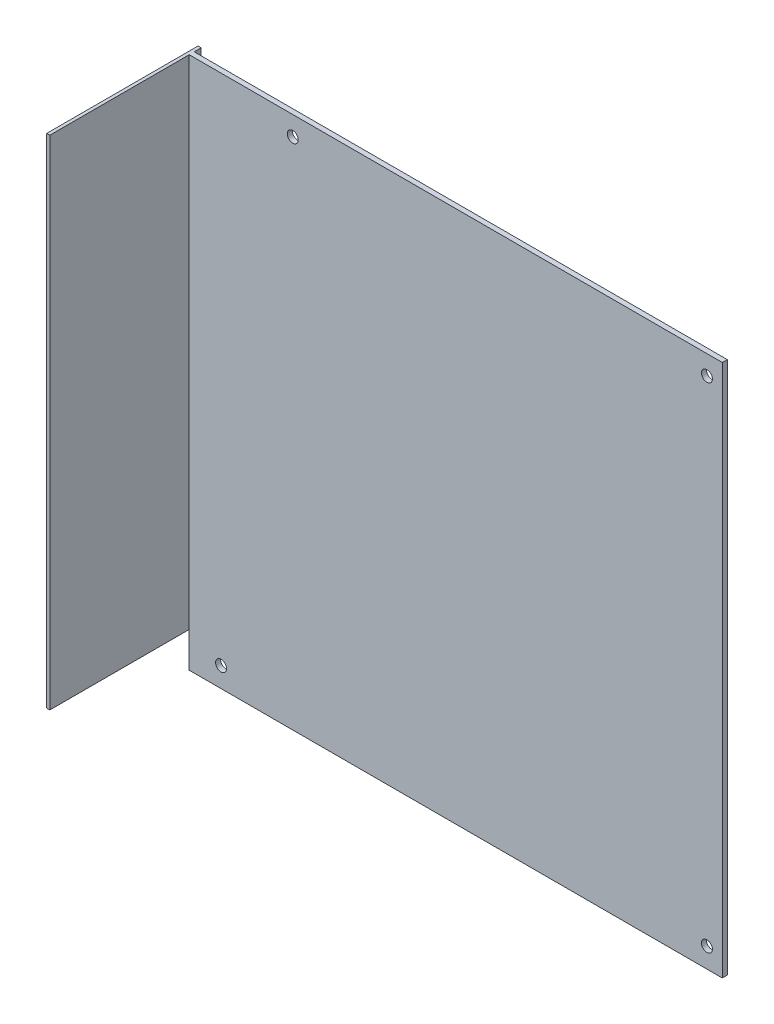
ISO-10303-21;
HEADER;
FILE_DESCRIPTION(('STEP AP214'),'2;1');
FILE_NAME('part.step','',(''),(''),'','','');
FILE_SCHEMA(('AUTOMOTIVE_DESIGN { 1 0 10303 214 1 1 1 1 }'));
ENDSEC;
DATA;
#1=APPLICATION_CONTEXT('core data for automotive mechanical design processes');
#2=APPLICATION_PROTOCOL_DEFINITION('international standard','automotive_design',2000,#1);
#3=PRODUCT_CONTEXT('',#1,'mechanical');
#4=PRODUCT('Part','Part','',(#3));
#5=PRODUCT_RELATED_PRODUCT_CATEGORY('part','',(#4));
#6=PRODUCT_DEFINITION_FORMATION('','',#4);
#7=PRODUCT_DEFINITION_CONTEXT('part definition',#1,'design');
#8=PRODUCT_DEFINITION('design','',#6,#7);
#9=PRODUCT_DEFINITION_SHAPE('','',#8);
#10=(LENGTH_UNIT() NAMED_UNIT(*) SI_UNIT(.MILLI.,.METRE.));
#11=(NAMED_UNIT(*) PLANE_ANGLE_UNIT() SI_UNIT($,.RADIAN.));
#12=(NAMED_UNIT(*) SI_UNIT($,.STERADIAN.) SOLID_ANGLE_UNIT());
#13=UNCERTAINTY_MEASURE_WITH_UNIT(LENGTH_MEASURE(1.E-05),#10,'distance_accuracy_value','');
#14=(GEOMETRIC_REPRESENTATION_CONTEXT(3) GLOBAL_UNCERTAINTY_ASSIGNED_CONTEXT((#13)) GLOBAL_UNIT_ASSIGNED_CONTEXT((#10,
#11,#12)) REPRESENTATION_CONTEXT('',''));
#15=CARTESIAN_POINT('',(0.,0.,0.));
#16=DIRECTION('',(0.,0.,1.));
#17=DIRECTION('',(1.,0.,0.));
#18=AXIS2_PLACEMENT_3D('',#15,#16,#17);
#19=CARTESIAN_POINT('',(0.,170.,1.6));
#20=DIRECTION('',(1.,0.,0.));
#21=DIRECTION('',(0.,1.,0.));
#22=AXIS2_PLACEMENT_3D('',#19,#20,#21);
#23=PLANE('',#22);
#24=DIRECTION('',(0.,0.,1.));
#25=VECTOR('',#24,1.);
#26=CARTESIAN_POINT('',(0.,11.25,-2.21));
#27=LINE('',#26,#25);
#28=CARTESIAN_POINT('',(0.,11.25,0.));
#29=VERTEX_POINT('',#28);
#30=CARTESIAN_POINT('',(0.,11.25,1.6));
#31=VERTEX_POINT('',#30);
#32=EDGE_CURVE('E11',#29,#31,#27,.T.);
#33=ORIENTED_EDGE('',*,*,#32,.F.);
#34=DIRECTION('',(0.,-1.,0.));
#35=VECTOR('',#34,1.);
#36=CARTESIAN_POINT('',(0.,170.,0.));
#37=LINE('',#36,#35);
#38=CARTESIAN_POINT('',(0.,0.,0.));
#39=VERTEX_POINT('',#38);
#40=EDGE_CURVE('E187',#29,#39,#37,.T.);
#41=ORIENTED_EDGE('',*,*,#40,.T.);
#42=DIRECTION('',(0.,0.,-1.));
#43=VECTOR('',#42,1.);
#44=CARTESIAN_POINT('',(0.,0.,1.6));
#45=LINE('',#44,#43);
#46=CARTESIAN_POINT('',(0.,0.,1.6));
#47=VERTEX_POINT('',#46);
#48=EDGE_CURVE('E50',#47,#39,#45,.T.);
#49=ORIENTED_EDGE('',*,*,#48,.F.);
#50=DIRECTION('',(0.,-1.,0.));
#51=VECTOR('',#50,1.);
#52=CARTESIAN_POINT('',(0.,170.,1.6));
#53=LINE('',#52,#51);
#54=EDGE_CURVE('E98',#31,#47,#53,.T.);
#55=ORIENTED_EDGE('',*,*,#54,.F.);
#56=EDGE_LOOP('',(#33,#41,#49,#55));
#57=FACE_BOUND('',#56,.T.);
#58=ADVANCED_FACE('F47',(#57),#23,.F.);
#59=CARTESIAN_POINT('',(0.,0.,1.6));
#60=DIRECTION('',(0.,1.,0.));
#61=DIRECTION('',(0.,0.,1.));
#62=AXIS2_PLACEMENT_3D('',#59,#60,#61);
#63=PLANE('',#62);
#64=DIRECTION('',(1.,0.,0.));
#65=VECTOR('',#64,1.);
#66=CARTESIAN_POINT('',(0.,0.,0.));
#67=LINE('',#66,#65);
#68=CARTESIAN_POINT('',(170.,0.,0.));
#69=VERTEX_POINT('',#68);
#70=EDGE_CURVE('E231',#39,#69,#67,.T.);
#71=ORIENTED_EDGE('',*,*,#70,.T.);
#72=DIRECTION('',(0.,0.,-1.));
#73=VECTOR('',#72,1.);
#74=CARTESIAN_POINT('',(170.,0.,1.6));
#75=LINE('',#74,#73);
#76=CARTESIAN_POINT('',(170.,0.,1.6));
#77=VERTEX_POINT('',#76);
#78=EDGE_CURVE('E240',#77,#69,#75,.T.);
#79=ORIENTED_EDGE('',*,*,#78,.F.);
#80=DIRECTION('',(1.,0.,0.));
#81=VECTOR('',#80,1.);
#82=CARTESIAN_POINT('',(0.,0.,1.6));
#83=LINE('',#82,#81);
#84=EDGE_CURVE('E218',#47,#77,#83,.T.);
#85=ORIENTED_EDGE('',*,*,#84,.F.);
#86=ORIENTED_EDGE('',*,*,#48,.T.);
#87=EDGE_LOOP('',(#71,#79,#85,#86));
#88=FACE_BOUND('',#87,.T.);
#89=ADVANCED_FACE('F251',(#88),#63,.F.);
#90=CARTESIAN_POINT('',(170.,0.,1.6));
#91=DIRECTION('',(-1.,0.,0.));
#92=DIRECTION('',(0.,0.,1.));
#93=AXIS2_PLACEMENT_3D('',#90,#91,#92);
#94=PLANE('',#93);
#95=DIRECTION('',(0.,1.,0.));
#96=VECTOR('',#95,1.);
#97=CARTESIAN_POINT('',(170.,0.,0.));
#98=LINE('',#97,#96);
#99=CARTESIAN_POINT('',(170.,170.,0.));
#100=VERTEX_POINT('',#99);
#101=EDGE_CURVE('E234',#69,#100,#98,.T.);
#102=ORIENTED_EDGE('',*,*,#101,.T.);
#103=DIRECTION('',(0.,0.,-1.));
#104=VECTOR('',#103,1.);
#105=CARTESIAN_POINT('',(170.,170.,1.6));
#106=LINE('',#105,#104);
#107=CARTESIAN_POINT('',(170.,170.,1.6));
#108=VERTEX_POINT('',#107);
#109=EDGE_CURVE('E226',#108,#100,#106,.T.);
#110=ORIENTED_EDGE('',*,*,#109,.F.);
#111=DIRECTION('',(0.,1.,0.));
#112=VECTOR('',#111,1.);
#113=CARTESIAN_POINT('',(170.,0.,1.6));
#114=LINE('',#113,#112);
#115=EDGE_CURVE('E221',#77,#108,#114,.T.);
#116=ORIENTED_EDGE('',*,*,#115,.F.);
#117=ORIENTED_EDGE('',*,*,#78,.T.);
#118=EDGE_LOOP('',(#102,#110,#116,#117));
#119=FACE_BOUND('',#118,.T.);
#120=ADVANCED_FACE('F257',(#119),#94,.F.);
#121=CARTESIAN_POINT('',(170.,170.,1.6));
#122=DIRECTION('',(0.,-1.,0.));
#123=DIRECTION('',(1.,0.,0.));
#124=AXIS2_PLACEMENT_3D('',#121,#122,#123);
#125=PLANE('',#124);
#126=DIRECTION('',(-1.,0.,0.));
#127=VECTOR('',#126,1.);
#128=CARTESIAN_POINT('',(170.,170.,0.));
#129=LINE('',#128,#127);
#130=CARTESIAN_POINT('',(0.,170.,0.));
#131=VERTEX_POINT('',#130);
#132=EDGE_CURVE('E93',#100,#131,#129,.T.);
#133=ORIENTED_EDGE('',*,*,#132,.T.);
#134=DIRECTION('',(0.,0.,1.));
#135=VECTOR('',#134,1.);
#136=CARTESIAN_POINT('',(0.,170.,-2.21));
#137=LINE('',#136,#135);
#138=CARTESIAN_POINT('',(0.,170.,-2.21));
#139=VERTEX_POINT('',#138);
#140=EDGE_CURVE('E177',#139,#131,#137,.T.);
#141=ORIENTED_EDGE('',*,*,#140,.F.);
#142=DIRECTION('',(-1.,0.,0.));
#143=VECTOR('',#142,1.);
#144=CARTESIAN_POINT('',(0.,170.,-2.21));
#145=LINE('',#144,#143);
#146=CARTESIAN_POINT('',(-1.,170.,-2.21));
#147=VERTEX_POINT('',#146);
#148=EDGE_CURVE('E138',#139,#147,#145,.T.);
#149=ORIENTED_EDGE('',*,*,#148,.T.);
#150=DIRECTION('',(0.,0.,1.));
#151=VECTOR('',#150,1.);
#152=CARTESIAN_POINT('',(-1.,170.,-2.21));
#153=LINE('',#152,#151);
#154=CARTESIAN_POINT('',(-1.,170.,46.05));
#155=VERTEX_POINT('',#154);
#156=EDGE_CURVE('E173',#147,#155,#153,.T.);
#157=ORIENTED_EDGE('',*,*,#156,.T.);
#158=DIRECTION('',(-1.,0.,0.));
#159=VECTOR('',#158,1.);
#160=CARTESIAN_POINT('',(0.,170.,46.05));
#161=LINE('',#160,#159);
#162=CARTESIAN_POINT('',(0.,170.,46.05));
#163=VERTEX_POINT('',#162);
#164=EDGE_CURVE('E154',#163,#155,#161,.T.);
#165=ORIENTED_EDGE('',*,*,#164,.F.);
#166=CARTESIAN_POINT('',(0.,170.,1.6));
#167=VERTEX_POINT('',#166);
#168=EDGE_CURVE('E180',#167,#163,#137,.T.);
#169=ORIENTED_EDGE('',*,*,#168,.F.);
#170=DIRECTION('',(-1.,0.,0.));
#171=VECTOR('',#170,1.);
#172=CARTESIAN_POINT('',(170.,170.,1.6));
#173=LINE('',#172,#171);
#174=EDGE_CURVE('E72',#108,#167,#173,.T.);
#175=ORIENTED_EDGE('',*,*,#174,.F.);
#176=ORIENTED_EDGE('',*,*,#109,.T.);
#177=EDGE_LOOP('',(#133,#141,#149,#157,#165,#169,#175,#176));
#178=FACE_BOUND('',#177,.T.);
#179=ADVANCED_FACE('F258',(#178),#125,.F.);
#180=CARTESIAN_POINT('',(0.,0.,1.6));
#181=DIRECTION('',(0.,0.,1.));
#182=DIRECTION('',(1.,0.,0.));
#183=AXIS2_PLACEMENT_3D('',#180,#181,#182);
#184=PLANE('',#183);
#185=CARTESIAN_POINT('',(10.16,6.35,1.6));
#186=DIRECTION('',(0.,0.,1.));
#187=DIRECTION('',(1.,0.,0.));
#188=AXIS2_PLACEMENT_3D('',#185,#186,#187);
#189=CIRCLE('',#188,1.75);
#190=CARTESIAN_POINT('',(11.91,6.35,1.6));
#191=VERTEX_POINT('',#190);
#192=EDGE_CURVE('E188',#191,#191,#189,.T.);
#193=ORIENTED_EDGE('',*,*,#192,.F.);
#194=EDGE_LOOP('',(#193));
#195=FACE_BOUND('',#194,.T.);
#196=CARTESIAN_POINT('',(165.1,6.35,1.6));
#197=DIRECTION('',(0.,0.,1.));
#198=DIRECTION('',(1.,0.,0.));
#199=AXIS2_PLACEMENT_3D('',#196,#197,#198);
#200=CIRCLE('',#199,1.75000000000001);
#201=CARTESIAN_POINT('',(166.85,6.35,1.6));
#202=VERTEX_POINT('',#201);
#203=EDGE_CURVE('E192',#202,#202,#200,.T.);
#204=ORIENTED_EDGE('',*,*,#203,.F.);
#205=EDGE_LOOP('',(#204));
#206=FACE_BOUND('',#205,.T.);
#207=CARTESIAN_POINT('',(165.1,163.83,1.6));
#208=DIRECTION('',(0.,0.,1.));
#209=DIRECTION('',(1.,0.,0.));
#210=AXIS2_PLACEMENT_3D('',#207,#208,#209);
#211=CIRCLE('',#210,1.75000000000001);
#212=CARTESIAN_POINT('',(166.85,163.83,1.6));
#213=VERTEX_POINT('',#212);
#214=EDGE_CURVE('E200',#213,#213,#211,.T.);
#215=ORIENTED_EDGE('',*,*,#214,.F.);
#216=EDGE_LOOP('',(#215));
#217=FACE_BOUND('',#216,.T.);
#218=CARTESIAN_POINT('',(33.02,163.83,1.6));
#219=DIRECTION('',(0.,0.,1.));
#220=DIRECTION('',(1.,0.,0.));
#221=AXIS2_PLACEMENT_3D('',#218,#219,#220);
#222=CIRCLE('',#221,1.75000000000001);
#223=CARTESIAN_POINT('',(34.77,163.83,1.6));
#224=VERTEX_POINT('',#223);
#225=EDGE_CURVE('E208',#224,#224,#222,.T.);
#226=ORIENTED_EDGE('',*,*,#225,.F.);
#227=EDGE_LOOP('',(#226));
#228=FACE_BOUND('',#227,.T.);
#229=EDGE_CURVE('E215',#167,#31,#53,.T.);
#230=ORIENTED_EDGE('',*,*,#229,.T.);
#231=ORIENTED_EDGE('',*,*,#54,.T.);
#232=ORIENTED_EDGE('',*,*,#84,.T.);
#233=ORIENTED_EDGE('',*,*,#115,.T.);
#234=ORIENTED_EDGE('',*,*,#174,.T.);
#235=EDGE_LOOP('',(#230,#231,#232,#233,#234));
#236=FACE_BOUND('',#235,.T.);
#237=ADVANCED_FACE('F265',(#195,#206,#217,#228,#236),#184,.T.);
#238=CARTESIAN_POINT('',(0.,0.,0.));
#239=DIRECTION('',(0.,0.,1.));
#240=DIRECTION('',(1.,0.,0.));
#241=AXIS2_PLACEMENT_3D('',#238,#239,#240);
#242=PLANE('',#241);
#243=CARTESIAN_POINT('',(10.16,6.35,0.));
#244=DIRECTION('',(0.,0.,1.));
#245=DIRECTION('',(1.,0.,0.));
#246=AXIS2_PLACEMENT_3D('',#243,#244,#245);
#247=CIRCLE('',#246,1.75);
#248=CARTESIAN_POINT('',(11.91,6.35,0.));
#249=VERTEX_POINT('',#248);
#250=EDGE_CURVE('E183',#249,#249,#247,.T.);
#251=ORIENTED_EDGE('',*,*,#250,.T.);
#252=EDGE_LOOP('',(#251));
#253=FACE_BOUND('',#252,.T.);
#254=CARTESIAN_POINT('',(165.1,6.35,0.));
#255=DIRECTION('',(0.,0.,1.));
#256=DIRECTION('',(1.,0.,0.));
#257=AXIS2_PLACEMENT_3D('',#254,#255,#256);
#258=CIRCLE('',#257,1.75000000000001);
#259=CARTESIAN_POINT('',(166.85,6.35,0.));
#260=VERTEX_POINT('',#259);
#261=EDGE_CURVE('E196',#260,#260,#258,.T.);
#262=ORIENTED_EDGE('',*,*,#261,.T.);
#263=EDGE_LOOP('',(#262));
#264=FACE_BOUND('',#263,.T.);
#265=CARTESIAN_POINT('',(165.1,163.83,0.));
#266=DIRECTION('',(0.,0.,1.));
#267=DIRECTION('',(1.,0.,0.));
#268=AXIS2_PLACEMENT_3D('',#265,#266,#267);
#269=CIRCLE('',#268,1.75000000000001);
#270=CARTESIAN_POINT('',(166.85,163.83,0.));
#271=VERTEX_POINT('',#270);
#272=EDGE_CURVE('E204',#271,#271,#269,.T.);
#273=ORIENTED_EDGE('',*,*,#272,.T.);
#274=EDGE_LOOP('',(#273));
#275=FACE_BOUND('',#274,.T.);
#276=CARTESIAN_POINT('',(33.02,163.83,0.));
#277=DIRECTION('',(0.,0.,1.));
#278=DIRECTION('',(1.,0.,0.));
#279=AXIS2_PLACEMENT_3D('',#276,#277,#278);
#280=CIRCLE('',#279,1.75000000000001);
#281=CARTESIAN_POINT('',(34.77,163.83,0.));
#282=VERTEX_POINT('',#281);
#283=EDGE_CURVE('E176',#282,#282,#280,.T.);
#284=ORIENTED_EDGE('',*,*,#283,.T.);
#285=EDGE_LOOP('',(#284));
#286=FACE_BOUND('',#285,.T.);
#287=EDGE_CURVE('E227',#131,#29,#37,.T.);
#288=ORIENTED_EDGE('',*,*,#287,.F.);
#289=ORIENTED_EDGE('',*,*,#132,.F.);
#290=ORIENTED_EDGE('',*,*,#101,.F.);
#291=ORIENTED_EDGE('',*,*,#70,.F.);
#292=ORIENTED_EDGE('',*,*,#40,.F.);
#293=EDGE_LOOP('',(#288,#289,#290,#291,#292));
#294=FACE_BOUND('',#293,.T.);
#295=ADVANCED_FACE('F255',(#253,#264,#275,#286,#294),#242,.F.);
#296=CARTESIAN_POINT('',(33.02,163.83,0.));
#297=DIRECTION('',(0.,0.,1.));
#298=DIRECTION('',(1.,0.,0.));
#299=AXIS2_PLACEMENT_3D('',#296,#297,#298);
#300=CYLINDRICAL_SURFACE('',#299,1.75000000000001);
#301=ORIENTED_EDGE('',*,*,#283,.F.);
#302=EDGE_LOOP('',(#301));
#303=FACE_BOUND('',#302,.T.);
#304=ORIENTED_EDGE('',*,*,#225,.T.);
#305=EDGE_LOOP('',(#304));
#306=FACE_BOUND('',#305,.T.);
#307=ADVANCED_FACE('F273',(#303,#306),#300,.F.);
#308=CARTESIAN_POINT('',(165.1,163.83,0.));
#309=DIRECTION('',(0.,0.,1.));
#310=DIRECTION('',(1.,0.,0.));
#311=AXIS2_PLACEMENT_3D('',#308,#309,#310);
#312=CYLINDRICAL_SURFACE('',#311,1.75000000000001);
#313=ORIENTED_EDGE('',*,*,#272,.F.);
#314=EDGE_LOOP('',(#313));
#315=FACE_BOUND('',#314,.T.);
#316=ORIENTED_EDGE('',*,*,#214,.T.);
#317=EDGE_LOOP('',(#316));
#318=FACE_BOUND('',#317,.T.);
#319=ADVANCED_FACE('F299',(#315,#318),#312,.F.);
#320=CARTESIAN_POINT('',(165.1,6.35,0.));
#321=DIRECTION('',(0.,0.,1.));
#322=DIRECTION('',(1.,0.,0.));
#323=AXIS2_PLACEMENT_3D('',#320,#321,#322);
#324=CYLINDRICAL_SURFACE('',#323,1.75000000000001);
#325=ORIENTED_EDGE('',*,*,#261,.F.);
#326=EDGE_LOOP('',(#325));
#327=FACE_BOUND('',#326,.T.);
#328=ORIENTED_EDGE('',*,*,#203,.T.);
#329=EDGE_LOOP('',(#328));
#330=FACE_BOUND('',#329,.T.);
#331=ADVANCED_FACE('F308',(#327,#330),#324,.F.);
#332=CARTESIAN_POINT('',(10.16,6.35,0.));
#333=DIRECTION('',(0.,0.,1.));
#334=DIRECTION('',(1.,0.,0.));
#335=AXIS2_PLACEMENT_3D('',#332,#333,#334);
#336=CYLINDRICAL_SURFACE('',#335,1.75);
#337=ORIENTED_EDGE('',*,*,#250,.F.);
#338=EDGE_LOOP('',(#337));
#339=FACE_BOUND('',#338,.T.);
#340=ORIENTED_EDGE('',*,*,#192,.T.);
#341=EDGE_LOOP('',(#340));
#342=FACE_BOUND('',#341,.T.);
#343=ADVANCED_FACE('F316',(#339,#342),#336,.F.);
#344=CARTESIAN_POINT('',(0.,0.,-2.21));
#345=DIRECTION('',(-1.,0.,0.));
#346=DIRECTION('',(0.,-1.,0.));
#347=AXIS2_PLACEMENT_3D('',#344,#345,#346);
#348=PLANE('',#347);
#349=ORIENTED_EDGE('',*,*,#140,.T.);
#350=ORIENTED_EDGE('',*,*,#287,.T.);
#351=CARTESIAN_POINT('',(0.,11.25,-2.21));
#352=VERTEX_POINT('',#351);
#353=EDGE_CURVE('E57',#352,#29,#27,.T.);
#354=ORIENTED_EDGE('',*,*,#353,.F.);
#355=DIRECTION('',(0.,-1.,0.));
#356=VECTOR('',#355,1.);
#357=CARTESIAN_POINT('',(0.,0.,-2.21));
#358=LINE('',#357,#356);
#359=EDGE_CURVE('E167',#139,#352,#358,.T.);
#360=ORIENTED_EDGE('',*,*,#359,.F.);
#361=EDGE_LOOP('',(#349,#350,#354,#360));
#362=FACE_BOUND('',#361,.T.);
#363=ADVANCED_FACE('F324',(#362),#348,.F.);
#364=CARTESIAN_POINT('',(-0.999999999999979,0.,-2.21));
#365=DIRECTION('',(-1.,0.,0.));
#366=DIRECTION('',(0.,-1.,0.));
#367=AXIS2_PLACEMENT_3D('',#364,#365,#366);
#368=PLANE('',#367);
#369=DIRECTION('',(0.,0.,1.));
#370=VECTOR('',#369,1.);
#371=CARTESIAN_POINT('',(-0.999999999999981,11.25,-2.21));
#372=LINE('',#371,#370);
#373=CARTESIAN_POINT('',(-0.999999999999981,11.25,-2.21));
#374=VERTEX_POINT('',#373);
#375=CARTESIAN_POINT('',(-0.999999999999981,11.25,46.05));
#376=VERTEX_POINT('',#375);
#377=EDGE_CURVE('E127',#374,#376,#372,.T.);
#378=ORIENTED_EDGE('',*,*,#377,.T.);
#379=DIRECTION('',(0.,-1.,0.));
#380=VECTOR('',#379,1.);
#381=CARTESIAN_POINT('',(-0.999999999999979,0.,46.05));
#382=LINE('',#381,#380);
#383=EDGE_CURVE('E131',#155,#376,#382,.T.);
#384=ORIENTED_EDGE('',*,*,#383,.F.);
#385=ORIENTED_EDGE('',*,*,#156,.F.);
#386=DIRECTION('',(0.,-1.,0.));
#387=VECTOR('',#386,1.);
#388=CARTESIAN_POINT('',(-0.999999999999979,0.,-2.21));
#389=LINE('',#388,#387);
#390=EDGE_CURVE('E133',#147,#374,#389,.T.);
#391=ORIENTED_EDGE('',*,*,#390,.T.);
#392=EDGE_LOOP('',(#378,#384,#385,#391));
#393=FACE_BOUND('',#392,.T.);
#394=ADVANCED_FACE('F129',(#393),#368,.T.);
#395=ORIENTED_EDGE('',*,*,#229,.F.);
#396=ORIENTED_EDGE('',*,*,#168,.T.);
#397=DIRECTION('',(0.,-1.,0.));
#398=VECTOR('',#397,1.);
#399=CARTESIAN_POINT('',(0.,0.,46.05));
#400=LINE('',#399,#398);
#401=CARTESIAN_POINT('',(0.,11.25,46.05));
#402=VERTEX_POINT('',#401);
#403=EDGE_CURVE('E149',#163,#402,#400,.T.);
#404=ORIENTED_EDGE('',*,*,#403,.T.);
#405=EDGE_CURVE('E58',#31,#402,#27,.T.);
#406=ORIENTED_EDGE('',*,*,#405,.F.);
#407=EDGE_LOOP('',(#395,#396,#404,#406));
#408=FACE_BOUND('',#407,.T.);
#409=ADVANCED_FACE('F264',(#408),#348,.F.);
#410=CARTESIAN_POINT('',(0.,11.25,-2.21));
#411=DIRECTION('',(0.,-1.,0.));
#412=DIRECTION('',(0.,0.,-1.));
#413=AXIS2_PLACEMENT_3D('',#410,#411,#412);
#414=PLANE('',#413);
#415=ORIENTED_EDGE('',*,*,#353,.T.);
#416=ORIENTED_EDGE('',*,*,#32,.T.);
#417=ORIENTED_EDGE('',*,*,#405,.T.);
#418=DIRECTION('',(1.,0.,0.));
#419=VECTOR('',#418,1.);
#420=CARTESIAN_POINT('',(0.,11.25,46.05));
#421=LINE('',#420,#419);
#422=EDGE_CURVE('E141',#376,#402,#421,.T.);
#423=ORIENTED_EDGE('',*,*,#422,.F.);
#424=ORIENTED_EDGE('',*,*,#377,.F.);
#425=DIRECTION('',(1.,0.,0.));
#426=VECTOR('',#425,1.);
#427=CARTESIAN_POINT('',(0.,11.25,-2.21));
#428=LINE('',#427,#426);
#429=EDGE_CURVE('E164',#374,#352,#428,.T.);
#430=ORIENTED_EDGE('',*,*,#429,.T.);
#431=EDGE_LOOP('',(#415,#416,#417,#423,#424,#430));
#432=FACE_BOUND('',#431,.T.);
#433=ADVANCED_FACE('F143',(#432),#414,.T.);
#434=CARTESIAN_POINT('',(0.,0.,-2.21));
#435=DIRECTION('',(0.,0.,1.));
#436=DIRECTION('',(1.,0.,0.));
#437=AXIS2_PLACEMENT_3D('',#434,#435,#436);
#438=PLANE('',#437);
#439=ORIENTED_EDGE('',*,*,#390,.F.);
#440=ORIENTED_EDGE('',*,*,#148,.F.);
#441=ORIENTED_EDGE('',*,*,#359,.T.);
#442=ORIENTED_EDGE('',*,*,#429,.F.);
#443=EDGE_LOOP('',(#439,#440,#441,#442));
#444=FACE_BOUND('',#443,.T.);
#445=ADVANCED_FACE('F378',(#444),#438,.F.);
#446=CARTESIAN_POINT('',(0.,0.,46.05));
#447=DIRECTION('',(0.,0.,1.));
#448=DIRECTION('',(1.,0.,0.));
#449=AXIS2_PLACEMENT_3D('',#446,#447,#448);
#450=PLANE('',#449);
#451=ORIENTED_EDGE('',*,*,#383,.T.);
#452=ORIENTED_EDGE('',*,*,#422,.T.);
#453=ORIENTED_EDGE('',*,*,#403,.F.);
#454=ORIENTED_EDGE('',*,*,#164,.T.);
#455=EDGE_LOOP('',(#451,#452,#453,#454));
#456=FACE_BOUND('',#455,.T.);
#457=ADVANCED_FACE('F152',(#456),#450,.T.);
#458=CLOSED_SHELL('',(#58,#89,#120,#179,#237,#295,#307,#319,#331,#343,#363,#394,#409,#433,#445,#457));
#459=MANIFOLD_SOLID_BREP('B2',#458);
#460=ADVANCED_BREP_SHAPE_REPRESENTATION('',(#18,#459),#14);
#461=SHAPE_DEFINITION_REPRESENTATION(#9,#460);
ENDSEC;
END-ISO-10303-21;
